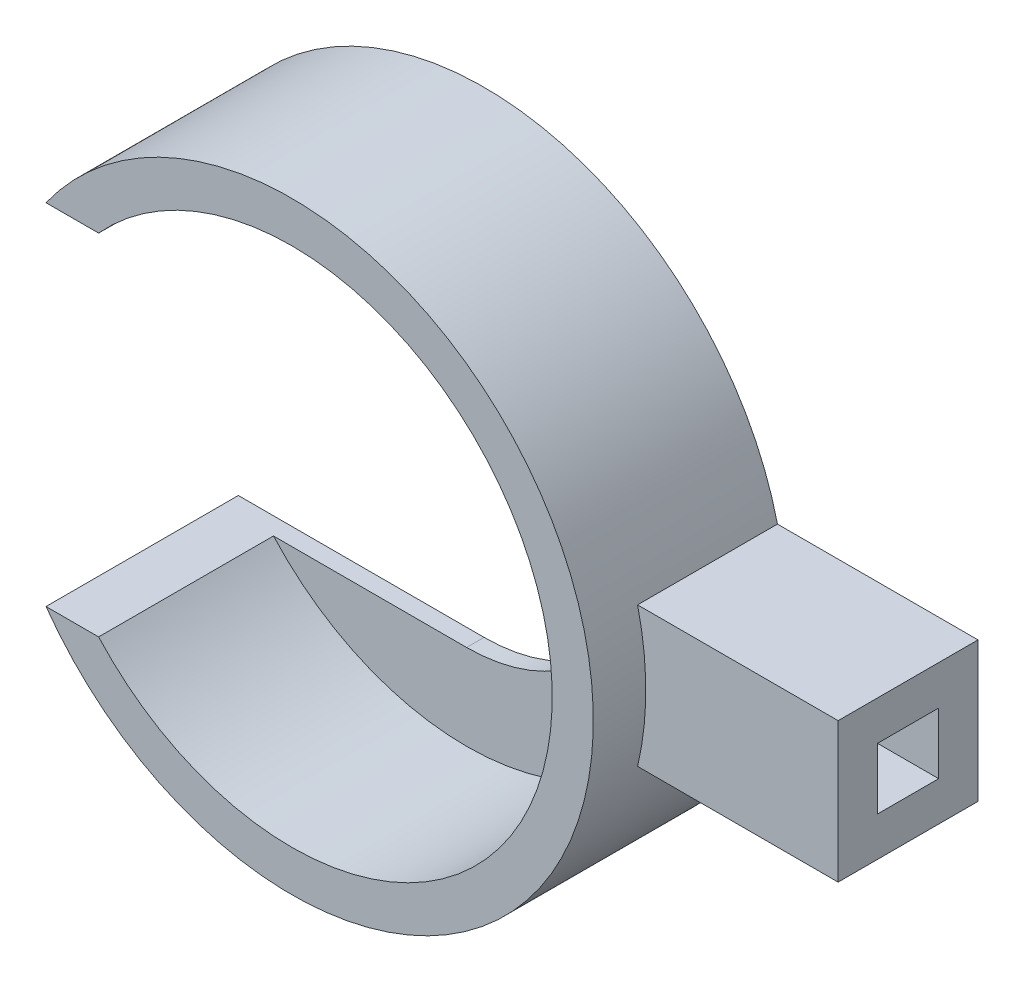
ISO-10303-21;
HEADER;
FILE_DESCRIPTION(('STEP AP214'),'2;1');
FILE_NAME('part.step','',(''),(''),'','','');
FILE_SCHEMA(('AUTOMOTIVE_DESIGN { 1 0 10303 214 1 1 1 1 }'));
ENDSEC;
DATA;
#1=APPLICATION_CONTEXT('core data for automotive mechanical design processes');
#2=APPLICATION_PROTOCOL_DEFINITION('international standard','automotive_design',2000,#1);
#3=PRODUCT_CONTEXT('',#1,'mechanical');
#4=PRODUCT('Part','Part','',(#3));
#5=PRODUCT_RELATED_PRODUCT_CATEGORY('part','',(#4));
#6=PRODUCT_DEFINITION_FORMATION('','',#4);
#7=PRODUCT_DEFINITION_CONTEXT('part definition',#1,'design');
#8=PRODUCT_DEFINITION('design','',#6,#7);
#9=PRODUCT_DEFINITION_SHAPE('','',#8);
#10=(LENGTH_UNIT() NAMED_UNIT(*) SI_UNIT(.MILLI.,.METRE.));
#11=(NAMED_UNIT(*) PLANE_ANGLE_UNIT() SI_UNIT($,.RADIAN.));
#12=(NAMED_UNIT(*) SI_UNIT($,.STERADIAN.) SOLID_ANGLE_UNIT());
#13=UNCERTAINTY_MEASURE_WITH_UNIT(LENGTH_MEASURE(1.E-05),#10,'distance_accuracy_value','');
#14=(GEOMETRIC_REPRESENTATION_CONTEXT(3) GLOBAL_UNCERTAINTY_ASSIGNED_CONTEXT((#13)) GLOBAL_UNIT_ASSIGNED_CONTEXT((#10,
#11,#12)) REPRESENTATION_CONTEXT('',''));
#15=CARTESIAN_POINT('',(0.,0.,0.));
#16=DIRECTION('',(0.,0.,1.));
#17=DIRECTION('',(1.,0.,0.));
#18=AXIS2_PLACEMENT_3D('',#15,#16,#17);
#19=CARTESIAN_POINT('',(0.,0.,10.));
#20=DIRECTION('',(0.,0.,-1.));
#21=DIRECTION('',(-1.,0.,0.));
#22=AXIS2_PLACEMENT_3D('',#19,#20,#21);
#23=CYLINDRICAL_SURFACE('',#22,17.25);
#24=DIRECTION('',(0.,0.,-1.));
#25=VECTOR('',#24,1.);
#26=CARTESIAN_POINT('',(16.7798241945498,4.,10.));
#27=LINE('',#26,#25);
#28=CARTESIAN_POINT('',(16.7798241945498,4.,-1.));
#29=VERTEX_POINT('',#28);
#30=CARTESIAN_POINT('',(16.7798241945498,4.,7.));
#31=VERTEX_POINT('',#30);
#32=EDGE_CURVE('E210',#29,#31,#27,.F.);
#33=ORIENTED_EDGE('',*,*,#32,.F.);
#34=CARTESIAN_POINT('',(0.,0.,-1.));
#35=DIRECTION('',(0.,0.,-1.));
#36=DIRECTION('',(-1.,0.,0.));
#37=AXIS2_PLACEMENT_3D('',#34,#35,#36);
#38=CIRCLE('',#37,17.25);
#39=CARTESIAN_POINT('',(-14.0556927968706,10.,-1.));
#40=VERTEX_POINT('',#39);
#41=EDGE_CURVE('E245',#40,#29,#38,.T.);
#42=ORIENTED_EDGE('',*,*,#41,.F.);
#43=DIRECTION('',(0.,0.,-1.));
#44=VECTOR('',#43,1.);
#45=CARTESIAN_POINT('',(-14.0556927968706,10.,10.));
#46=LINE('',#45,#44);
#47=CARTESIAN_POINT('',(-14.0556927968706,10.,10.));
#48=VERTEX_POINT('',#47);
#49=EDGE_CURVE('E224',#48,#40,#46,.T.);
#50=ORIENTED_EDGE('',*,*,#49,.F.);
#51=CARTESIAN_POINT('',(0.,0.,10.));
#52=DIRECTION('',(0.,0.,1.));
#53=DIRECTION('',(1.,0.,0.));
#54=AXIS2_PLACEMENT_3D('',#51,#52,#53);
#55=CIRCLE('',#54,17.25);
#56=CARTESIAN_POINT('',(-14.0556927968706,-10.,10.));
#57=VERTEX_POINT('',#56);
#58=EDGE_CURVE('E252',#57,#48,#55,.T.);
#59=ORIENTED_EDGE('',*,*,#58,.F.);
#60=DIRECTION('',(0.,0.,-1.));
#61=VECTOR('',#60,1.);
#62=CARTESIAN_POINT('',(-14.0556927968706,-10.,10.));
#63=LINE('',#62,#61);
#64=CARTESIAN_POINT('',(-14.0556927968706,-10.,-1.));
#65=VERTEX_POINT('',#64);
#66=EDGE_CURVE('E219',#57,#65,#63,.T.);
#67=ORIENTED_EDGE('',*,*,#66,.T.);
#68=CARTESIAN_POINT('',(16.7798241945498,-4.,-1.));
#69=VERTEX_POINT('',#68);
#70=EDGE_CURVE('E242',#69,#65,#38,.T.);
#71=ORIENTED_EDGE('',*,*,#70,.F.);
#72=DIRECTION('',(0.,0.,-1.));
#73=VECTOR('',#72,1.);
#74=CARTESIAN_POINT('',(16.7798241945498,-4.,10.));
#75=LINE('',#74,#73);
#76=CARTESIAN_POINT('',(16.7798241945498,-4.,7.));
#77=VERTEX_POINT('',#76);
#78=EDGE_CURVE('E194',#69,#77,#75,.F.);
#79=ORIENTED_EDGE('',*,*,#78,.T.);
#80=CARTESIAN_POINT('',(0.,0.,7.));
#81=DIRECTION('',(0.,0.,-1.));
#82=DIRECTION('',(0.,1.,0.));
#83=AXIS2_PLACEMENT_3D('',#80,#81,#82);
#84=CIRCLE('',#83,17.25);
#85=EDGE_CURVE('E12',#31,#77,#84,.T.);
#86=ORIENTED_EDGE('',*,*,#85,.F.);
#87=EDGE_LOOP('',(#33,#42,#50,#59,#67,#71,#79,#86));
#88=FACE_BOUND('',#87,.T.);
#89=ADVANCED_FACE('F34',(#88),#23,.T.);
#90=CARTESIAN_POINT('',(0.,0.,10.));
#91=DIRECTION('',(0.,0.,1.));
#92=DIRECTION('',(1.,0.,0.));
#93=AXIS2_PLACEMENT_3D('',#90,#91,#92);
#94=PLANE('',#93);
#95=ORIENTED_EDGE('',*,*,#58,.T.);
#96=DIRECTION('',(-1.,0.,0.));
#97=VECTOR('',#96,1.);
#98=CARTESIAN_POINT('',(0.,10.,10.));
#99=LINE('',#98,#97);
#100=CARTESIAN_POINT('',(-11.0458136866416,10.,10.));
#101=VERTEX_POINT('',#100);
#102=EDGE_CURVE('E216',#101,#48,#99,.T.);
#103=ORIENTED_EDGE('',*,*,#102,.F.);
#104=CARTESIAN_POINT('',(0.,0.,10.));
#105=DIRECTION('',(0.,0.,1.));
#106=DIRECTION('',(1.,0.,0.));
#107=AXIS2_PLACEMENT_3D('',#104,#105,#106);
#108=CIRCLE('',#107,14.9);
#109=CARTESIAN_POINT('',(-11.0458136866416,-10.,10.));
#110=VERTEX_POINT('',#109);
#111=EDGE_CURVE('E249',#110,#101,#108,.T.);
#112=ORIENTED_EDGE('',*,*,#111,.F.);
#113=DIRECTION('',(-1.,0.,0.));
#114=VECTOR('',#113,1.);
#115=CARTESIAN_POINT('',(0.,-10.,10.));
#116=LINE('',#115,#114);
#117=EDGE_CURVE('E213',#110,#57,#116,.T.);
#118=ORIENTED_EDGE('',*,*,#117,.T.);
#119=EDGE_LOOP('',(#95,#103,#112,#118));
#120=FACE_BOUND('',#119,.T.);
#121=ADVANCED_FACE('F285',(#120),#94,.T.);
#122=CARTESIAN_POINT('',(0.,0.,10.));
#123=DIRECTION('',(0.,0.,-1.));
#124=DIRECTION('',(-1.,0.,0.));
#125=AXIS2_PLACEMENT_3D('',#122,#123,#124);
#126=CYLINDRICAL_SURFACE('',#125,14.9);
#127=ORIENTED_EDGE('',*,*,#111,.T.);
#128=DIRECTION('',(0.,0.,-1.));
#129=VECTOR('',#128,1.);
#130=CARTESIAN_POINT('',(-11.0458136866416,10.,10.));
#131=LINE('',#130,#129);
#132=CARTESIAN_POINT('',(-11.0458136866416,10.,0.));
#133=VERTEX_POINT('',#132);
#134=EDGE_CURVE('E235',#101,#133,#131,.T.);
#135=ORIENTED_EDGE('',*,*,#134,.T.);
#136=CARTESIAN_POINT('',(0.,0.,0.));
#137=DIRECTION('',(0.,0.,1.));
#138=DIRECTION('',(1.,0.,0.));
#139=AXIS2_PLACEMENT_3D('',#136,#137,#138);
#140=CIRCLE('',#139,14.9);
#141=CARTESIAN_POINT('',(-11.0458136866416,-10.,0.));
#142=VERTEX_POINT('',#141);
#143=EDGE_CURVE('E248',#142,#133,#140,.T.);
#144=ORIENTED_EDGE('',*,*,#143,.F.);
#145=DIRECTION('',(0.,0.,-1.));
#146=VECTOR('',#145,1.);
#147=CARTESIAN_POINT('',(-11.0458136866416,-10.,10.));
#148=LINE('',#147,#146);
#149=EDGE_CURVE('E231',#110,#142,#148,.T.);
#150=ORIENTED_EDGE('',*,*,#149,.F.);
#151=EDGE_LOOP('',(#127,#135,#144,#150));
#152=FACE_BOUND('',#151,.T.);
#153=ADVANCED_FACE('F288',(#152),#126,.F.);
#154=CARTESIAN_POINT('',(0.,0.,0.));
#155=DIRECTION('',(0.,0.,-1.));
#156=DIRECTION('',(-1.,0.,0.));
#157=AXIS2_PLACEMENT_3D('',#154,#155,#156);
#158=PLANE('',#157);
#159=DIRECTION('',(-1.,0.,0.));
#160=VECTOR('',#159,1.);
#161=CARTESIAN_POINT('',(0.,10.,0.));
#162=LINE('',#161,#160);
#163=CARTESIAN_POINT('',(0.,10.,0.));
#164=VERTEX_POINT('',#163);
#165=EDGE_CURVE('E233',#164,#133,#162,.T.);
#166=ORIENTED_EDGE('',*,*,#165,.F.);
#167=CARTESIAN_POINT('',(0.,0.,0.));
#168=DIRECTION('',(0.,0.,-1.));
#169=DIRECTION('',(-1.,0.,0.));
#170=AXIS2_PLACEMENT_3D('',#167,#168,#169);
#171=CIRCLE('',#170,10.);
#172=CARTESIAN_POINT('',(0.,-10.,0.));
#173=VERTEX_POINT('',#172);
#174=EDGE_CURVE('E238',#164,#173,#171,.T.);
#175=ORIENTED_EDGE('',*,*,#174,.T.);
#176=DIRECTION('',(-1.,0.,0.));
#177=VECTOR('',#176,1.);
#178=CARTESIAN_POINT('',(0.,-10.,0.));
#179=LINE('',#178,#177);
#180=EDGE_CURVE('E226',#173,#142,#179,.T.);
#181=ORIENTED_EDGE('',*,*,#180,.T.);
#182=ORIENTED_EDGE('',*,*,#143,.T.);
#183=EDGE_LOOP('',(#166,#175,#181,#182));
#184=FACE_BOUND('',#183,.T.);
#185=ADVANCED_FACE('F267',(#184),#158,.F.);
#186=CARTESIAN_POINT('',(0.,0.,-1.));
#187=DIRECTION('',(0.,0.,-1.));
#188=DIRECTION('',(-1.,0.,0.));
#189=AXIS2_PLACEMENT_3D('',#186,#187,#188);
#190=PLANE('',#189);
#191=ORIENTED_EDGE('',*,*,#41,.T.);
#192=DIRECTION('',(-1.,0.,0.));
#193=VECTOR('',#192,1.);
#194=CARTESIAN_POINT('',(17.25,4.,-1.));
#195=LINE('',#194,#193);
#196=CARTESIAN_POINT('',(28.25,4.,-1.));
#197=VERTEX_POINT('',#196);
#198=EDGE_CURVE('E174',#197,#29,#195,.T.);
#199=ORIENTED_EDGE('',*,*,#198,.F.);
#200=DIRECTION('',(0.,1.,0.));
#201=VECTOR('',#200,1.);
#202=CARTESIAN_POINT('',(28.25,0.,-1.));
#203=LINE('',#202,#201);
#204=CARTESIAN_POINT('',(28.25,-4.,-1.));
#205=VERTEX_POINT('',#204);
#206=EDGE_CURVE('E168',#205,#197,#203,.T.);
#207=ORIENTED_EDGE('',*,*,#206,.F.);
#208=DIRECTION('',(-1.,0.,0.));
#209=VECTOR('',#208,1.);
#210=CARTESIAN_POINT('',(17.25,-4.,-1.));
#211=LINE('',#210,#209);
#212=EDGE_CURVE('E191',#205,#69,#211,.T.);
#213=ORIENTED_EDGE('',*,*,#212,.T.);
#214=ORIENTED_EDGE('',*,*,#70,.T.);
#215=DIRECTION('',(-1.,0.,0.));
#216=VECTOR('',#215,1.);
#217=CARTESIAN_POINT('',(0.,-10.,-1.));
#218=LINE('',#217,#216);
#219=CARTESIAN_POINT('',(0.,-10.,-1.));
#220=VERTEX_POINT('',#219);
#221=EDGE_CURVE('E212',#220,#65,#218,.T.);
#222=ORIENTED_EDGE('',*,*,#221,.F.);
#223=CARTESIAN_POINT('',(0.,0.,-1.));
#224=DIRECTION('',(0.,0.,-1.));
#225=DIRECTION('',(-1.,0.,0.));
#226=AXIS2_PLACEMENT_3D('',#223,#224,#225);
#227=CIRCLE('',#226,10.);
#228=CARTESIAN_POINT('',(0.,10.,-1.));
#229=VERTEX_POINT('',#228);
#230=EDGE_CURVE('E239',#229,#220,#227,.T.);
#231=ORIENTED_EDGE('',*,*,#230,.F.);
#232=DIRECTION('',(-1.,0.,0.));
#233=VECTOR('',#232,1.);
#234=CARTESIAN_POINT('',(0.,10.,-1.));
#235=LINE('',#234,#233);
#236=EDGE_CURVE('E217',#229,#40,#235,.T.);
#237=ORIENTED_EDGE('',*,*,#236,.T.);
#238=EDGE_LOOP('',(#191,#199,#207,#213,#214,#222,#231,#237));
#239=FACE_BOUND('',#238,.T.);
#240=ADVANCED_FACE('F274',(#239),#190,.T.);
#241=CARTESIAN_POINT('',(0.,0.,-1.));
#242=DIRECTION('',(0.,0.,1.));
#243=DIRECTION('',(1.,0.,0.));
#244=AXIS2_PLACEMENT_3D('',#241,#242,#243);
#245=CYLINDRICAL_SURFACE('',#244,10.);
#246=DIRECTION('',(0.,0.,1.));
#247=VECTOR('',#246,1.);
#248=CARTESIAN_POINT('',(0.,10.,-1.));
#249=LINE('',#248,#247);
#250=EDGE_CURVE('E41',#229,#164,#249,.T.);
#251=ORIENTED_EDGE('',*,*,#250,.F.);
#252=ORIENTED_EDGE('',*,*,#230,.T.);
#253=DIRECTION('',(0.,0.,1.));
#254=VECTOR('',#253,1.);
#255=CARTESIAN_POINT('',(0.,-10.,-1.));
#256=LINE('',#255,#254);
#257=EDGE_CURVE('E257',#220,#173,#256,.T.);
#258=ORIENTED_EDGE('',*,*,#257,.T.);
#259=ORIENTED_EDGE('',*,*,#174,.F.);
#260=EDGE_LOOP('',(#251,#252,#258,#259));
#261=FACE_BOUND('',#260,.T.);
#262=ADVANCED_FACE('F269',(#261),#245,.F.);
#263=CARTESIAN_POINT('',(0.,-10.,10.));
#264=DIRECTION('',(0.,-1.,0.));
#265=DIRECTION('',(0.,0.,-1.));
#266=AXIS2_PLACEMENT_3D('',#263,#264,#265);
#267=PLANE('',#266);
#268=ORIENTED_EDGE('',*,*,#149,.T.);
#269=ORIENTED_EDGE('',*,*,#180,.F.);
#270=ORIENTED_EDGE('',*,*,#257,.F.);
#271=ORIENTED_EDGE('',*,*,#221,.T.);
#272=ORIENTED_EDGE('',*,*,#66,.F.);
#273=ORIENTED_EDGE('',*,*,#117,.F.);
#274=EDGE_LOOP('',(#268,#269,#270,#271,#272,#273));
#275=FACE_BOUND('',#274,.T.);
#276=ADVANCED_FACE('F272',(#275),#267,.F.);
#277=CARTESIAN_POINT('',(0.,10.,10.));
#278=DIRECTION('',(0.,-1.,0.));
#279=DIRECTION('',(0.,0.,-1.));
#280=AXIS2_PLACEMENT_3D('',#277,#278,#279);
#281=PLANE('',#280);
#282=ORIENTED_EDGE('',*,*,#102,.T.);
#283=ORIENTED_EDGE('',*,*,#49,.T.);
#284=ORIENTED_EDGE('',*,*,#236,.F.);
#285=ORIENTED_EDGE('',*,*,#250,.T.);
#286=ORIENTED_EDGE('',*,*,#165,.T.);
#287=ORIENTED_EDGE('',*,*,#134,.F.);
#288=EDGE_LOOP('',(#282,#283,#284,#285,#286,#287));
#289=FACE_BOUND('',#288,.T.);
#290=ADVANCED_FACE('F262',(#289),#281,.T.);
#291=CARTESIAN_POINT('',(17.25,4.,-1.));
#292=DIRECTION('',(0.,-1.,0.));
#293=DIRECTION('',(0.,0.,-1.));
#294=AXIS2_PLACEMENT_3D('',#291,#292,#293);
#295=PLANE('',#294);
#296=ORIENTED_EDGE('',*,*,#198,.T.);
#297=ORIENTED_EDGE('',*,*,#32,.T.);
#298=DIRECTION('',(-1.,0.,0.));
#299=VECTOR('',#298,1.);
#300=CARTESIAN_POINT('',(17.25,4.,7.));
#301=LINE('',#300,#299);
#302=CARTESIAN_POINT('',(28.25,4.,7.));
#303=VERTEX_POINT('',#302);
#304=EDGE_CURVE('E198',#303,#31,#301,.T.);
#305=ORIENTED_EDGE('',*,*,#304,.F.);
#306=DIRECTION('',(0.,0.,1.));
#307=VECTOR('',#306,1.);
#308=CARTESIAN_POINT('',(28.25,4.,-1.));
#309=LINE('',#308,#307);
#310=EDGE_CURVE('E180',#197,#303,#309,.T.);
#311=ORIENTED_EDGE('',*,*,#310,.F.);
#312=EDGE_LOOP('',(#296,#297,#305,#311));
#313=FACE_BOUND('',#312,.T.);
#314=ADVANCED_FACE('F296',(#313),#295,.F.);
#315=CARTESIAN_POINT('',(17.25,-4.,-1.));
#316=DIRECTION('',(0.,-1.,0.));
#317=DIRECTION('',(0.,0.,-1.));
#318=AXIS2_PLACEMENT_3D('',#315,#316,#317);
#319=PLANE('',#318);
#320=ORIENTED_EDGE('',*,*,#78,.F.);
#321=ORIENTED_EDGE('',*,*,#212,.F.);
#322=DIRECTION('',(0.,0.,1.));
#323=VECTOR('',#322,1.);
#324=CARTESIAN_POINT('',(28.25,-4.,-1.));
#325=LINE('',#324,#323);
#326=CARTESIAN_POINT('',(28.25,-4.,7.));
#327=VERTEX_POINT('',#326);
#328=EDGE_CURVE('E172',#205,#327,#325,.T.);
#329=ORIENTED_EDGE('',*,*,#328,.T.);
#330=DIRECTION('',(-1.,0.,0.));
#331=VECTOR('',#330,1.);
#332=CARTESIAN_POINT('',(17.25,-4.,7.));
#333=LINE('',#332,#331);
#334=EDGE_CURVE('E56',#327,#77,#333,.T.);
#335=ORIENTED_EDGE('',*,*,#334,.T.);
#336=EDGE_LOOP('',(#320,#321,#329,#335));
#337=FACE_BOUND('',#336,.T.);
#338=ADVANCED_FACE('F299',(#337),#319,.T.);
#339=CARTESIAN_POINT('',(17.25,4.,7.));
#340=DIRECTION('',(0.,0.,-1.));
#341=DIRECTION('',(0.,1.,0.));
#342=AXIS2_PLACEMENT_3D('',#339,#340,#341);
#343=PLANE('',#342);
#344=ORIENTED_EDGE('',*,*,#304,.T.);
#345=ORIENTED_EDGE('',*,*,#85,.T.);
#346=ORIENTED_EDGE('',*,*,#334,.F.);
#347=DIRECTION('',(0.,-1.,0.));
#348=VECTOR('',#347,1.);
#349=CARTESIAN_POINT('',(28.25,4.,7.));
#350=LINE('',#349,#348);
#351=EDGE_CURVE('E175',#303,#327,#350,.T.);
#352=ORIENTED_EDGE('',*,*,#351,.F.);
#353=EDGE_LOOP('',(#344,#345,#346,#352));
#354=FACE_BOUND('',#353,.T.);
#355=ADVANCED_FACE('F298',(#354),#343,.F.);
#356=CARTESIAN_POINT('',(28.25,0.,0.));
#357=DIRECTION('',(-1.,0.,0.));
#358=DIRECTION('',(0.,0.,1.));
#359=AXIS2_PLACEMENT_3D('',#356,#357,#358);
#360=PLANE('',#359);
#361=DIRECTION('',(0.,1.,0.));
#362=VECTOR('',#361,1.);
#363=CARTESIAN_POINT('',(28.25,-1.75,1.24999999999997));
#364=LINE('',#363,#362);
#365=CARTESIAN_POINT('',(28.25,-1.75,1.24999999999997));
#366=VERTEX_POINT('',#365);
#367=CARTESIAN_POINT('',(28.25,1.75,1.24999999999997));
#368=VERTEX_POINT('',#367);
#369=EDGE_CURVE('E162',#366,#368,#364,.T.);
#370=ORIENTED_EDGE('',*,*,#369,.F.);
#371=DIRECTION('',(0.,0.,-1.));
#372=VECTOR('',#371,1.);
#373=CARTESIAN_POINT('',(28.25,-1.75,4.74999999999997));
#374=LINE('',#373,#372);
#375=CARTESIAN_POINT('',(28.25,-1.75,4.74999999999997));
#376=VERTEX_POINT('',#375);
#377=EDGE_CURVE('E48',#376,#366,#374,.T.);
#378=ORIENTED_EDGE('',*,*,#377,.F.);
#379=DIRECTION('',(0.,-1.,0.));
#380=VECTOR('',#379,1.);
#381=CARTESIAN_POINT('',(28.25,-1.75,4.74999999999997));
#382=LINE('',#381,#380);
#383=CARTESIAN_POINT('',(28.25,1.75,4.74999999999997));
#384=VERTEX_POINT('',#383);
#385=EDGE_CURVE('E153',#384,#376,#382,.T.);
#386=ORIENTED_EDGE('',*,*,#385,.F.);
#387=DIRECTION('',(0.,0.,1.));
#388=VECTOR('',#387,1.);
#389=CARTESIAN_POINT('',(28.25,1.75,4.74999999999997));
#390=LINE('',#389,#388);
#391=EDGE_CURVE('E156',#368,#384,#390,.T.);
#392=ORIENTED_EDGE('',*,*,#391,.F.);
#393=EDGE_LOOP('',(#370,#378,#386,#392));
#394=FACE_BOUND('',#393,.T.);
#395=ORIENTED_EDGE('',*,*,#206,.T.);
#396=ORIENTED_EDGE('',*,*,#310,.T.);
#397=ORIENTED_EDGE('',*,*,#351,.T.);
#398=ORIENTED_EDGE('',*,*,#328,.F.);
#399=EDGE_LOOP('',(#395,#396,#397,#398));
#400=FACE_BOUND('',#399,.T.);
#401=ADVANCED_FACE('F294',(#394,#400),#360,.F.);
#402=CARTESIAN_POINT('',(24.75,-1.75,4.74999999999997));
#403=DIRECTION('',(0.,-1.,0.));
#404=DIRECTION('',(0.,0.,-1.));
#405=AXIS2_PLACEMENT_3D('',#402,#403,#404);
#406=PLANE('',#405);
#407=ORIENTED_EDGE('',*,*,#377,.T.);
#408=DIRECTION('',(1.,0.,0.));
#409=VECTOR('',#408,1.);
#410=CARTESIAN_POINT('',(24.75,-1.75,1.24999999999997));
#411=LINE('',#410,#409);
#412=CARTESIAN_POINT('',(24.75,-1.75,1.24999999999997));
#413=VERTEX_POINT('',#412);
#414=EDGE_CURVE('E131',#413,#366,#411,.T.);
#415=ORIENTED_EDGE('',*,*,#414,.F.);
#416=DIRECTION('',(0.,0.,-1.));
#417=VECTOR('',#416,1.);
#418=CARTESIAN_POINT('',(24.75,-1.75,4.74999999999997));
#419=LINE('',#418,#417);
#420=CARTESIAN_POINT('',(24.75,-1.75,4.74999999999997));
#421=VERTEX_POINT('',#420);
#422=EDGE_CURVE('E135',#421,#413,#419,.T.);
#423=ORIENTED_EDGE('',*,*,#422,.F.);
#424=DIRECTION('',(1.,0.,0.));
#425=VECTOR('',#424,1.);
#426=CARTESIAN_POINT('',(24.75,-1.75,4.74999999999997));
#427=LINE('',#426,#425);
#428=EDGE_CURVE('E166',#421,#376,#427,.T.);
#429=ORIENTED_EDGE('',*,*,#428,.T.);
#430=EDGE_LOOP('',(#407,#415,#423,#429));
#431=FACE_BOUND('',#430,.T.);
#432=ADVANCED_FACE('F133',(#431),#406,.F.);
#433=CARTESIAN_POINT('',(24.75,-1.75,4.74999999999997));
#434=DIRECTION('',(0.,0.,1.));
#435=DIRECTION('',(1.,0.,0.));
#436=AXIS2_PLACEMENT_3D('',#433,#434,#435);
#437=PLANE('',#436);
#438=ORIENTED_EDGE('',*,*,#385,.T.);
#439=ORIENTED_EDGE('',*,*,#428,.F.);
#440=DIRECTION('',(0.,-1.,0.));
#441=VECTOR('',#440,1.);
#442=CARTESIAN_POINT('',(24.75,-1.75,4.74999999999997));
#443=LINE('',#442,#441);
#444=CARTESIAN_POINT('',(24.75,1.75,4.74999999999997));
#445=VERTEX_POINT('',#444);
#446=EDGE_CURVE('E141',#445,#421,#443,.T.);
#447=ORIENTED_EDGE('',*,*,#446,.F.);
#448=DIRECTION('',(1.,0.,0.));
#449=VECTOR('',#448,1.);
#450=CARTESIAN_POINT('',(24.75,1.75,4.74999999999997));
#451=LINE('',#450,#449);
#452=EDGE_CURVE('E169',#445,#384,#451,.T.);
#453=ORIENTED_EDGE('',*,*,#452,.T.);
#454=EDGE_LOOP('',(#438,#439,#447,#453));
#455=FACE_BOUND('',#454,.T.);
#456=ADVANCED_FACE('F365',(#455),#437,.F.);
#457=CARTESIAN_POINT('',(24.75,1.75,4.74999999999997));
#458=DIRECTION('',(0.,1.,0.));
#459=DIRECTION('',(0.,0.,1.));
#460=AXIS2_PLACEMENT_3D('',#457,#458,#459);
#461=PLANE('',#460);
#462=ORIENTED_EDGE('',*,*,#391,.T.);
#463=ORIENTED_EDGE('',*,*,#452,.F.);
#464=DIRECTION('',(0.,0.,1.));
#465=VECTOR('',#464,1.);
#466=CARTESIAN_POINT('',(24.75,1.75,4.74999999999997));
#467=LINE('',#466,#465);
#468=CARTESIAN_POINT('',(24.75,1.75,1.24999999999997));
#469=VERTEX_POINT('',#468);
#470=EDGE_CURVE('E149',#469,#445,#467,.T.);
#471=ORIENTED_EDGE('',*,*,#470,.F.);
#472=DIRECTION('',(1.,0.,0.));
#473=VECTOR('',#472,1.);
#474=CARTESIAN_POINT('',(24.75,1.75,1.24999999999997));
#475=LINE('',#474,#473);
#476=EDGE_CURVE('E140',#469,#368,#475,.T.);
#477=ORIENTED_EDGE('',*,*,#476,.T.);
#478=EDGE_LOOP('',(#462,#463,#471,#477));
#479=FACE_BOUND('',#478,.T.);
#480=ADVANCED_FACE('F374',(#479),#461,.F.);
#481=CARTESIAN_POINT('',(24.75,-1.75,1.24999999999997));
#482=DIRECTION('',(0.,0.,-1.));
#483=DIRECTION('',(-1.,0.,0.));
#484=AXIS2_PLACEMENT_3D('',#481,#482,#483);
#485=PLANE('',#484);
#486=ORIENTED_EDGE('',*,*,#369,.T.);
#487=ORIENTED_EDGE('',*,*,#476,.F.);
#488=DIRECTION('',(0.,1.,0.));
#489=VECTOR('',#488,1.);
#490=CARTESIAN_POINT('',(24.75,-1.75,1.24999999999997));
#491=LINE('',#490,#489);
#492=EDGE_CURVE('E144',#413,#469,#491,.T.);
#493=ORIENTED_EDGE('',*,*,#492,.F.);
#494=ORIENTED_EDGE('',*,*,#414,.T.);
#495=EDGE_LOOP('',(#486,#487,#493,#494));
#496=FACE_BOUND('',#495,.T.);
#497=ADVANCED_FACE('F145',(#496),#485,.F.);
#498=CARTESIAN_POINT('',(24.75,0.,0.));
#499=DIRECTION('',(1.,0.,0.));
#500=DIRECTION('',(0.,0.,-1.));
#501=AXIS2_PLACEMENT_3D('',#498,#499,#500);
#502=PLANE('',#501);
#503=ORIENTED_EDGE('',*,*,#422,.T.);
#504=ORIENTED_EDGE('',*,*,#492,.T.);
#505=ORIENTED_EDGE('',*,*,#470,.T.);
#506=ORIENTED_EDGE('',*,*,#446,.T.);
#507=EDGE_LOOP('',(#503,#504,#505,#506));
#508=FACE_BOUND('',#507,.T.);
#509=ADVANCED_FACE('F151',(#508),#502,.T.);
#510=CLOSED_SHELL('',(#89,#121,#153,#185,#240,#262,#276,#290,#314,#338,#355,#401,#432,#456,#480,
#497,#509));
#511=MANIFOLD_SOLID_BREP('B2',#510);
#512=ADVANCED_BREP_SHAPE_REPRESENTATION('',(#18,#511),#14);
#513=SHAPE_DEFINITION_REPRESENTATION(#9,#512);
ENDSEC;
END-ISO-10303-21;
